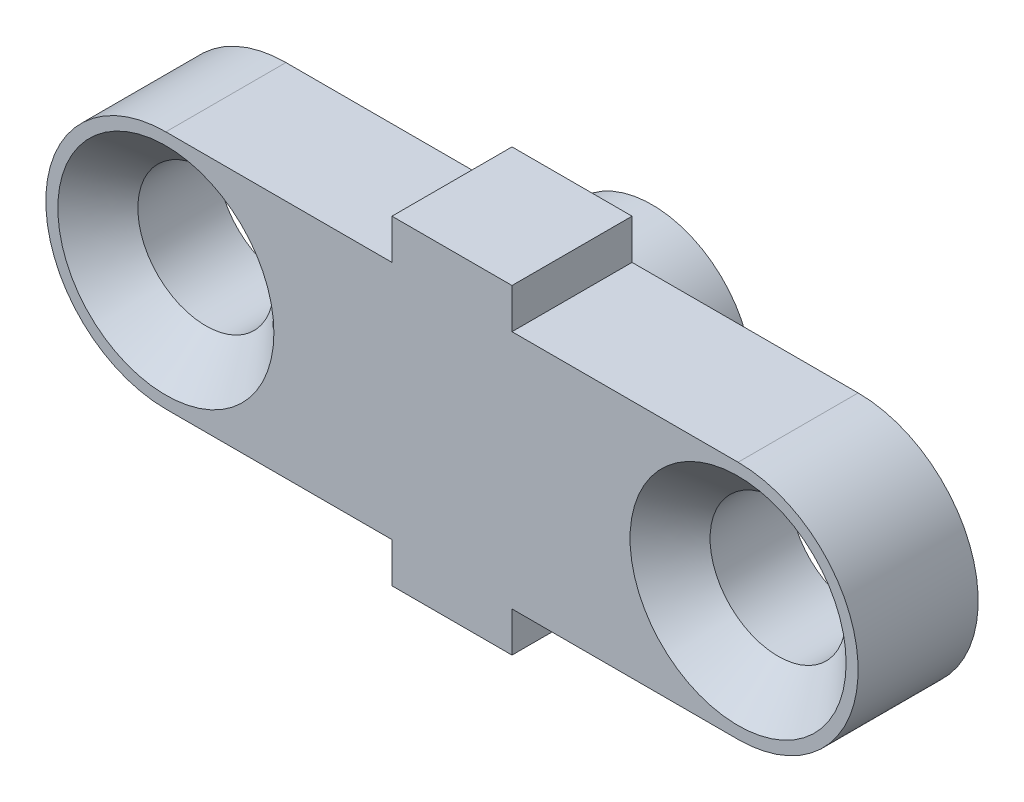
ISO-10303-21;
HEADER;
FILE_DESCRIPTION(('STEP AP214'),'2;1');
FILE_NAME('part.step','',(''),(''),'','','');
FILE_SCHEMA(('AUTOMOTIVE_DESIGN { 1 0 10303 214 1 1 1 1 }'));
ENDSEC;
DATA;
#1=APPLICATION_CONTEXT('core data for automotive mechanical design processes');
#2=APPLICATION_PROTOCOL_DEFINITION('international standard','automotive_design',2000,#1);
#3=PRODUCT_CONTEXT('',#1,'mechanical');
#4=PRODUCT('Part','Part','',(#3));
#5=PRODUCT_RELATED_PRODUCT_CATEGORY('part','',(#4));
#6=PRODUCT_DEFINITION_FORMATION('','',#4);
#7=PRODUCT_DEFINITION_CONTEXT('part definition',#1,'design');
#8=PRODUCT_DEFINITION('design','',#6,#7);
#9=PRODUCT_DEFINITION_SHAPE('','',#8);
#10=(LENGTH_UNIT() NAMED_UNIT(*) SI_UNIT(.MILLI.,.METRE.));
#11=(NAMED_UNIT(*) PLANE_ANGLE_UNIT() SI_UNIT($,.RADIAN.));
#12=(NAMED_UNIT(*) SI_UNIT($,.STERADIAN.) SOLID_ANGLE_UNIT());
#13=UNCERTAINTY_MEASURE_WITH_UNIT(LENGTH_MEASURE(1.E-05),#10,'distance_accuracy_value','');
#14=(GEOMETRIC_REPRESENTATION_CONTEXT(3) GLOBAL_UNCERTAINTY_ASSIGNED_CONTEXT((#13)) GLOBAL_UNIT_ASSIGNED_CONTEXT((#10,
#11,#12)) REPRESENTATION_CONTEXT('',''));
#15=CARTESIAN_POINT('',(0.,0.,0.));
#16=DIRECTION('',(0.,0.,1.));
#17=DIRECTION('',(1.,0.,0.));
#18=AXIS2_PLACEMENT_3D('',#15,#16,#17);
#19=CARTESIAN_POINT('',(-7.15,0.,3.));
#20=DIRECTION('',(0.,0.,1.));
#21=DIRECTION('',(1.,0.,0.));
#22=AXIS2_PLACEMENT_3D('',#19,#20,#21);
#23=PLANE('',#22);
#24=CARTESIAN_POINT('',(7.15,0.,3.));
#25=DIRECTION('',(0.,0.,1.));
#26=DIRECTION('',(1.,0.,0.));
#27=AXIS2_PLACEMENT_3D('',#24,#25,#26);
#28=CIRCLE('',#27,2.70000000000001);
#29=CARTESIAN_POINT('',(9.85000000000001,0.,3.));
#30=VERTEX_POINT('',#29);
#31=EDGE_CURVE('E213',#30,#30,#28,.F.);
#32=ORIENTED_EDGE('',*,*,#31,.T.);
#33=EDGE_LOOP('',(#32));
#34=FACE_BOUND('',#33,.T.);
#35=CARTESIAN_POINT('',(-7.15,0.,3.));
#36=DIRECTION('',(0.,0.,1.));
#37=DIRECTION('',(1.,0.,0.));
#38=AXIS2_PLACEMENT_3D('',#35,#36,#37);
#39=CIRCLE('',#38,2.7);
#40=CARTESIAN_POINT('',(-4.45,0.,3.));
#41=VERTEX_POINT('',#40);
#42=EDGE_CURVE('E210',#41,#41,#39,.F.);
#43=ORIENTED_EDGE('',*,*,#42,.T.);
#44=EDGE_LOOP('',(#43));
#45=FACE_BOUND('',#44,.T.);
#46=DIRECTION('',(0.,-1.,0.));
#47=VECTOR('',#46,1.);
#48=CARTESIAN_POINT('',(-1.5,4.,3.));
#49=LINE('',#48,#47);
#50=CARTESIAN_POINT('',(-1.5,4.,3.));
#51=VERTEX_POINT('',#50);
#52=CARTESIAN_POINT('',(-1.5,3.,3.));
#53=VERTEX_POINT('',#52);
#54=EDGE_CURVE('E180',#51,#53,#49,.T.);
#55=ORIENTED_EDGE('',*,*,#54,.T.);
#56=DIRECTION('',(-1.,0.,0.));
#57=VECTOR('',#56,1.);
#58=CARTESIAN_POINT('',(-7.15,3.,3.));
#59=LINE('',#58,#57);
#60=CARTESIAN_POINT('',(-7.15,3.,3.));
#61=VERTEX_POINT('',#60);
#62=EDGE_CURVE('E109',#53,#61,#59,.T.);
#63=ORIENTED_EDGE('',*,*,#62,.T.);
#64=CARTESIAN_POINT('',(-7.15,0.,3.));
#65=DIRECTION('',(0.,0.,1.));
#66=DIRECTION('',(1.,0.,0.));
#67=AXIS2_PLACEMENT_3D('',#64,#65,#66);
#68=CIRCLE('',#67,3.);
#69=CARTESIAN_POINT('',(-7.15,-3.,3.));
#70=VERTEX_POINT('',#69);
#71=EDGE_CURVE('E305',#61,#70,#68,.T.);
#72=ORIENTED_EDGE('',*,*,#71,.T.);
#73=DIRECTION('',(1.,0.,0.));
#74=VECTOR('',#73,1.);
#75=CARTESIAN_POINT('',(-7.15,-3.,3.));
#76=LINE('',#75,#74);
#77=CARTESIAN_POINT('',(-1.5,-3.,3.));
#78=VERTEX_POINT('',#77);
#79=EDGE_CURVE('E307',#70,#78,#76,.T.);
#80=ORIENTED_EDGE('',*,*,#79,.T.);
#81=DIRECTION('',(0.,-1.,0.));
#82=VECTOR('',#81,1.);
#83=CARTESIAN_POINT('',(-1.5,-3.,3.));
#84=LINE('',#83,#82);
#85=CARTESIAN_POINT('',(-1.5,-4.,3.));
#86=VERTEX_POINT('',#85);
#87=EDGE_CURVE('E309',#78,#86,#84,.T.);
#88=ORIENTED_EDGE('',*,*,#87,.T.);
#89=DIRECTION('',(1.,0.,0.));
#90=VECTOR('',#89,1.);
#91=CARTESIAN_POINT('',(-1.5,-4.,3.));
#92=LINE('',#91,#90);
#93=CARTESIAN_POINT('',(1.5,-4.,3.));
#94=VERTEX_POINT('',#93);
#95=EDGE_CURVE('E315',#86,#94,#92,.T.);
#96=ORIENTED_EDGE('',*,*,#95,.T.);
#97=DIRECTION('',(0.,1.,0.));
#98=VECTOR('',#97,1.);
#99=CARTESIAN_POINT('',(1.5,-3.,3.));
#100=LINE('',#99,#98);
#101=CARTESIAN_POINT('',(1.5,-3.,3.));
#102=VERTEX_POINT('',#101);
#103=EDGE_CURVE('E317',#94,#102,#100,.T.);
#104=ORIENTED_EDGE('',*,*,#103,.T.);
#105=DIRECTION('',(1.,0.,0.));
#106=VECTOR('',#105,1.);
#107=CARTESIAN_POINT('',(1.5,-3.,3.));
#108=LINE('',#107,#106);
#109=CARTESIAN_POINT('',(7.15,-3.,3.));
#110=VERTEX_POINT('',#109);
#111=EDGE_CURVE('E319',#102,#110,#108,.T.);
#112=ORIENTED_EDGE('',*,*,#111,.T.);
#113=CARTESIAN_POINT('',(7.15,0.,3.));
#114=DIRECTION('',(0.,0.,1.));
#115=DIRECTION('',(1.,0.,0.));
#116=AXIS2_PLACEMENT_3D('',#113,#114,#115);
#117=CIRCLE('',#116,3.);
#118=CARTESIAN_POINT('',(7.15,3.,3.));
#119=VERTEX_POINT('',#118);
#120=EDGE_CURVE('E139',#110,#119,#117,.T.);
#121=ORIENTED_EDGE('',*,*,#120,.T.);
#122=DIRECTION('',(-1.,0.,0.));
#123=VECTOR('',#122,1.);
#124=CARTESIAN_POINT('',(1.5,3.,3.));
#125=LINE('',#124,#123);
#126=CARTESIAN_POINT('',(1.5,3.,3.));
#127=VERTEX_POINT('',#126);
#128=EDGE_CURVE('E134',#119,#127,#125,.T.);
#129=ORIENTED_EDGE('',*,*,#128,.T.);
#130=DIRECTION('',(0.,1.,0.));
#131=VECTOR('',#130,1.);
#132=CARTESIAN_POINT('',(1.5,4.,3.));
#133=LINE('',#132,#131);
#134=CARTESIAN_POINT('',(1.5,4.,3.));
#135=VERTEX_POINT('',#134);
#136=EDGE_CURVE('E137',#127,#135,#133,.T.);
#137=ORIENTED_EDGE('',*,*,#136,.T.);
#138=DIRECTION('',(-1.,0.,0.));
#139=VECTOR('',#138,1.);
#140=CARTESIAN_POINT('',(-1.5,4.,3.));
#141=LINE('',#140,#139);
#142=EDGE_CURVE('E53',#135,#51,#141,.T.);
#143=ORIENTED_EDGE('',*,*,#142,.T.);
#144=EDGE_LOOP('',(#55,#63,#72,#80,#88,#96,#104,#112,#121,#129,#137,#143));
#145=FACE_BOUND('',#144,.T.);
#146=ADVANCED_FACE('F35',(#34,#45,#145),#23,.T.);
#147=CARTESIAN_POINT('',(-7.15,0.,0.));
#148=DIRECTION('',(0.,0.,1.));
#149=DIRECTION('',(1.,0.,0.));
#150=AXIS2_PLACEMENT_3D('',#147,#148,#149);
#151=PLANE('',#150);
#152=CARTESIAN_POINT('',(0.,0.,0.));
#153=DIRECTION('',(0.,0.,1.));
#154=DIRECTION('',(1.,0.,0.));
#155=AXIS2_PLACEMENT_3D('',#152,#153,#154);
#156=CIRCLE('',#155,2.5);
#157=CARTESIAN_POINT('',(2.5,0.,0.));
#158=VERTEX_POINT('',#157);
#159=EDGE_CURVE('E11',#158,#158,#156,.F.);
#160=ORIENTED_EDGE('',*,*,#159,.F.);
#161=EDGE_LOOP('',(#160));
#162=FACE_BOUND('',#161,.T.);
#163=DIRECTION('',(0.,-1.,0.));
#164=VECTOR('',#163,1.);
#165=CARTESIAN_POINT('',(-1.5,4.,0.));
#166=LINE('',#165,#164);
#167=CARTESIAN_POINT('',(-1.5,4.,0.));
#168=VERTEX_POINT('',#167);
#169=CARTESIAN_POINT('',(-1.5,3.,0.));
#170=VERTEX_POINT('',#169);
#171=EDGE_CURVE('E157',#168,#170,#166,.T.);
#172=ORIENTED_EDGE('',*,*,#171,.F.);
#173=DIRECTION('',(-1.,0.,0.));
#174=VECTOR('',#173,1.);
#175=CARTESIAN_POINT('',(-1.5,4.,0.));
#176=LINE('',#175,#174);
#177=CARTESIAN_POINT('',(1.5,4.,0.));
#178=VERTEX_POINT('',#177);
#179=EDGE_CURVE('E100',#178,#168,#176,.T.);
#180=ORIENTED_EDGE('',*,*,#179,.F.);
#181=DIRECTION('',(0.,1.,0.));
#182=VECTOR('',#181,1.);
#183=CARTESIAN_POINT('',(1.5,4.,0.));
#184=LINE('',#183,#182);
#185=CARTESIAN_POINT('',(1.5,3.,0.));
#186=VERTEX_POINT('',#185);
#187=EDGE_CURVE('E94',#186,#178,#184,.T.);
#188=ORIENTED_EDGE('',*,*,#187,.F.);
#189=DIRECTION('',(-1.,0.,0.));
#190=VECTOR('',#189,1.);
#191=CARTESIAN_POINT('',(1.5,3.,0.));
#192=LINE('',#191,#190);
#193=CARTESIAN_POINT('',(7.15,3.,0.));
#194=VERTEX_POINT('',#193);
#195=EDGE_CURVE('E147',#194,#186,#192,.T.);
#196=ORIENTED_EDGE('',*,*,#195,.F.);
#197=CARTESIAN_POINT('',(7.15,0.,0.));
#198=DIRECTION('',(0.,0.,1.));
#199=DIRECTION('',(1.,0.,0.));
#200=AXIS2_PLACEMENT_3D('',#197,#198,#199);
#201=CIRCLE('',#200,3.);
#202=CARTESIAN_POINT('',(7.15,-3.,0.));
#203=VERTEX_POINT('',#202);
#204=EDGE_CURVE('E175',#203,#194,#201,.T.);
#205=ORIENTED_EDGE('',*,*,#204,.F.);
#206=DIRECTION('',(1.,0.,0.));
#207=VECTOR('',#206,1.);
#208=CARTESIAN_POINT('',(1.5,-3.,0.));
#209=LINE('',#208,#207);
#210=CARTESIAN_POINT('',(1.5,-3.,0.));
#211=VERTEX_POINT('',#210);
#212=EDGE_CURVE('E173',#211,#203,#209,.T.);
#213=ORIENTED_EDGE('',*,*,#212,.F.);
#214=DIRECTION('',(0.,1.,0.));
#215=VECTOR('',#214,1.);
#216=CARTESIAN_POINT('',(1.5,-3.,0.));
#217=LINE('',#216,#215);
#218=CARTESIAN_POINT('',(1.5,-4.,0.));
#219=VERTEX_POINT('',#218);
#220=EDGE_CURVE('E171',#219,#211,#217,.T.);
#221=ORIENTED_EDGE('',*,*,#220,.F.);
#222=DIRECTION('',(1.,0.,0.));
#223=VECTOR('',#222,1.);
#224=CARTESIAN_POINT('',(-1.5,-4.,0.));
#225=LINE('',#224,#223);
#226=CARTESIAN_POINT('',(-1.5,-4.,0.));
#227=VERTEX_POINT('',#226);
#228=EDGE_CURVE('E169',#227,#219,#225,.T.);
#229=ORIENTED_EDGE('',*,*,#228,.F.);
#230=DIRECTION('',(0.,-1.,0.));
#231=VECTOR('',#230,1.);
#232=CARTESIAN_POINT('',(-1.5,-3.,0.));
#233=LINE('',#232,#231);
#234=CARTESIAN_POINT('',(-1.5,-3.,0.));
#235=VERTEX_POINT('',#234);
#236=EDGE_CURVE('E167',#235,#227,#233,.T.);
#237=ORIENTED_EDGE('',*,*,#236,.F.);
#238=DIRECTION('',(1.,0.,0.));
#239=VECTOR('',#238,1.);
#240=CARTESIAN_POINT('',(-7.15,-3.,0.));
#241=LINE('',#240,#239);
#242=CARTESIAN_POINT('',(-7.15,-3.,0.));
#243=VERTEX_POINT('',#242);
#244=EDGE_CURVE('E165',#243,#235,#241,.T.);
#245=ORIENTED_EDGE('',*,*,#244,.F.);
#246=CARTESIAN_POINT('',(-7.15,0.,0.));
#247=DIRECTION('',(0.,0.,1.));
#248=DIRECTION('',(1.,0.,0.));
#249=AXIS2_PLACEMENT_3D('',#246,#247,#248);
#250=CIRCLE('',#249,3.);
#251=CARTESIAN_POINT('',(-7.15,3.,0.));
#252=VERTEX_POINT('',#251);
#253=EDGE_CURVE('E163',#252,#243,#250,.T.);
#254=ORIENTED_EDGE('',*,*,#253,.F.);
#255=DIRECTION('',(-1.,0.,0.));
#256=VECTOR('',#255,1.);
#257=CARTESIAN_POINT('',(-7.15,3.,0.));
#258=LINE('',#257,#256);
#259=EDGE_CURVE('E160',#170,#252,#258,.T.);
#260=ORIENTED_EDGE('',*,*,#259,.F.);
#261=EDGE_LOOP('',(#172,#180,#188,#196,#205,#213,#221,#229,#237,#245,#254,#260));
#262=FACE_BOUND('',#261,.T.);
#263=CARTESIAN_POINT('',(7.15,0.,0.));
#264=DIRECTION('',(0.,0.,1.));
#265=DIRECTION('',(1.,0.,0.));
#266=AXIS2_PLACEMENT_3D('',#263,#264,#265);
#267=CIRCLE('',#266,1.7);
#268=CARTESIAN_POINT('',(8.85,0.,0.));
#269=VERTEX_POINT('',#268);
#270=EDGE_CURVE('E161',#269,#269,#267,.T.);
#271=ORIENTED_EDGE('',*,*,#270,.T.);
#272=EDGE_LOOP('',(#271));
#273=FACE_BOUND('',#272,.T.);
#274=CARTESIAN_POINT('',(-7.15,0.,0.));
#275=DIRECTION('',(0.,0.,1.));
#276=DIRECTION('',(1.,0.,0.));
#277=AXIS2_PLACEMENT_3D('',#274,#275,#276);
#278=CIRCLE('',#277,1.7);
#279=CARTESIAN_POINT('',(-5.45,0.,0.));
#280=VERTEX_POINT('',#279);
#281=EDGE_CURVE('E337',#280,#280,#278,.T.);
#282=ORIENTED_EDGE('',*,*,#281,.T.);
#283=EDGE_LOOP('',(#282));
#284=FACE_BOUND('',#283,.T.);
#285=ADVANCED_FACE('F235',(#162,#262,#273,#284),#151,.F.);
#286=CARTESIAN_POINT('',(-1.5,4.,3.));
#287=DIRECTION('',(1.,0.,0.));
#288=DIRECTION('',(0.,1.,0.));
#289=AXIS2_PLACEMENT_3D('',#286,#287,#288);
#290=PLANE('',#289);
#291=ORIENTED_EDGE('',*,*,#171,.T.);
#292=DIRECTION('',(0.,0.,-1.));
#293=VECTOR('',#292,1.);
#294=CARTESIAN_POINT('',(-1.5,3.,3.));
#295=LINE('',#294,#293);
#296=EDGE_CURVE('E205',#53,#170,#295,.T.);
#297=ORIENTED_EDGE('',*,*,#296,.F.);
#298=ORIENTED_EDGE('',*,*,#54,.F.);
#299=DIRECTION('',(0.,0.,-1.));
#300=VECTOR('',#299,1.);
#301=CARTESIAN_POINT('',(-1.5,4.,3.));
#302=LINE('',#301,#300);
#303=EDGE_CURVE('E153',#51,#168,#302,.T.);
#304=ORIENTED_EDGE('',*,*,#303,.T.);
#305=EDGE_LOOP('',(#291,#297,#298,#304));
#306=FACE_BOUND('',#305,.T.);
#307=ADVANCED_FACE('F241',(#306),#290,.F.);
#308=CARTESIAN_POINT('',(-7.15,3.,3.));
#309=DIRECTION('',(0.,-1.,0.));
#310=DIRECTION('',(0.,0.,-1.));
#311=AXIS2_PLACEMENT_3D('',#308,#309,#310);
#312=PLANE('',#311);
#313=ORIENTED_EDGE('',*,*,#259,.T.);
#314=DIRECTION('',(0.,0.,-1.));
#315=VECTOR('',#314,1.);
#316=CARTESIAN_POINT('',(-7.15,3.,3.));
#317=LINE('',#316,#315);
#318=EDGE_CURVE('E202',#61,#252,#317,.T.);
#319=ORIENTED_EDGE('',*,*,#318,.F.);
#320=ORIENTED_EDGE('',*,*,#62,.F.);
#321=ORIENTED_EDGE('',*,*,#296,.T.);
#322=EDGE_LOOP('',(#313,#319,#320,#321));
#323=FACE_BOUND('',#322,.T.);
#324=ADVANCED_FACE('F283',(#323),#312,.F.);
#325=CARTESIAN_POINT('',(-7.15,0.,3.));
#326=DIRECTION('',(0.,0.,-1.));
#327=DIRECTION('',(-1.,0.,0.));
#328=AXIS2_PLACEMENT_3D('',#325,#326,#327);
#329=CYLINDRICAL_SURFACE('',#328,3.);
#330=ORIENTED_EDGE('',*,*,#253,.T.);
#331=DIRECTION('',(0.,0.,-1.));
#332=VECTOR('',#331,1.);
#333=CARTESIAN_POINT('',(-7.15,-3.,3.));
#334=LINE('',#333,#332);
#335=EDGE_CURVE('E199',#70,#243,#334,.T.);
#336=ORIENTED_EDGE('',*,*,#335,.F.);
#337=ORIENTED_EDGE('',*,*,#71,.F.);
#338=ORIENTED_EDGE('',*,*,#318,.T.);
#339=EDGE_LOOP('',(#330,#336,#337,#338));
#340=FACE_BOUND('',#339,.T.);
#341=ADVANCED_FACE('F279',(#340),#329,.T.);
#342=CARTESIAN_POINT('',(-7.15,-3.,3.));
#343=DIRECTION('',(0.,1.,0.));
#344=DIRECTION('',(0.,0.,1.));
#345=AXIS2_PLACEMENT_3D('',#342,#343,#344);
#346=PLANE('',#345);
#347=ORIENTED_EDGE('',*,*,#244,.T.);
#348=DIRECTION('',(0.,0.,-1.));
#349=VECTOR('',#348,1.);
#350=CARTESIAN_POINT('',(-1.5,-3.,3.));
#351=LINE('',#350,#349);
#352=EDGE_CURVE('E196',#78,#235,#351,.T.);
#353=ORIENTED_EDGE('',*,*,#352,.F.);
#354=ORIENTED_EDGE('',*,*,#79,.F.);
#355=ORIENTED_EDGE('',*,*,#335,.T.);
#356=EDGE_LOOP('',(#347,#353,#354,#355));
#357=FACE_BOUND('',#356,.T.);
#358=ADVANCED_FACE('F275',(#357),#346,.F.);
#359=CARTESIAN_POINT('',(-1.5,-3.,3.));
#360=DIRECTION('',(1.,0.,0.));
#361=DIRECTION('',(0.,0.,-1.));
#362=AXIS2_PLACEMENT_3D('',#359,#360,#361);
#363=PLANE('',#362);
#364=ORIENTED_EDGE('',*,*,#236,.T.);
#365=DIRECTION('',(0.,0.,-1.));
#366=VECTOR('',#365,1.);
#367=CARTESIAN_POINT('',(-1.5,-4.,3.));
#368=LINE('',#367,#366);
#369=EDGE_CURVE('E193',#86,#227,#368,.T.);
#370=ORIENTED_EDGE('',*,*,#369,.F.);
#371=ORIENTED_EDGE('',*,*,#87,.F.);
#372=ORIENTED_EDGE('',*,*,#352,.T.);
#373=EDGE_LOOP('',(#364,#370,#371,#372));
#374=FACE_BOUND('',#373,.T.);
#375=ADVANCED_FACE('F271',(#374),#363,.F.);
#376=CARTESIAN_POINT('',(-1.5,-4.,3.));
#377=DIRECTION('',(0.,1.,0.));
#378=DIRECTION('',(0.,0.,1.));
#379=AXIS2_PLACEMENT_3D('',#376,#377,#378);
#380=PLANE('',#379);
#381=ORIENTED_EDGE('',*,*,#228,.T.);
#382=DIRECTION('',(0.,0.,-1.));
#383=VECTOR('',#382,1.);
#384=CARTESIAN_POINT('',(1.5,-4.,3.));
#385=LINE('',#384,#383);
#386=EDGE_CURVE('E190',#94,#219,#385,.T.);
#387=ORIENTED_EDGE('',*,*,#386,.F.);
#388=ORIENTED_EDGE('',*,*,#95,.F.);
#389=ORIENTED_EDGE('',*,*,#369,.T.);
#390=EDGE_LOOP('',(#381,#387,#388,#389));
#391=FACE_BOUND('',#390,.T.);
#392=ADVANCED_FACE('F267',(#391),#380,.F.);
#393=CARTESIAN_POINT('',(1.5,-3.,3.));
#394=DIRECTION('',(-1.,0.,0.));
#395=DIRECTION('',(0.,-1.,0.));
#396=AXIS2_PLACEMENT_3D('',#393,#394,#395);
#397=PLANE('',#396);
#398=ORIENTED_EDGE('',*,*,#220,.T.);
#399=DIRECTION('',(0.,0.,-1.));
#400=VECTOR('',#399,1.);
#401=CARTESIAN_POINT('',(1.5,-3.,3.));
#402=LINE('',#401,#400);
#403=EDGE_CURVE('E187',#102,#211,#402,.T.);
#404=ORIENTED_EDGE('',*,*,#403,.F.);
#405=ORIENTED_EDGE('',*,*,#103,.F.);
#406=ORIENTED_EDGE('',*,*,#386,.T.);
#407=EDGE_LOOP('',(#398,#404,#405,#406));
#408=FACE_BOUND('',#407,.T.);
#409=ADVANCED_FACE('F263',(#408),#397,.F.);
#410=CARTESIAN_POINT('',(1.5,-3.,3.));
#411=DIRECTION('',(0.,1.,0.));
#412=DIRECTION('',(-1.,0.,0.));
#413=AXIS2_PLACEMENT_3D('',#410,#411,#412);
#414=PLANE('',#413);
#415=ORIENTED_EDGE('',*,*,#212,.T.);
#416=DIRECTION('',(0.,0.,-1.));
#417=VECTOR('',#416,1.);
#418=CARTESIAN_POINT('',(7.15,-3.,3.));
#419=LINE('',#418,#417);
#420=EDGE_CURVE('E184',#110,#203,#419,.T.);
#421=ORIENTED_EDGE('',*,*,#420,.F.);
#422=ORIENTED_EDGE('',*,*,#111,.F.);
#423=ORIENTED_EDGE('',*,*,#403,.T.);
#424=EDGE_LOOP('',(#415,#421,#422,#423));
#425=FACE_BOUND('',#424,.T.);
#426=ADVANCED_FACE('F259',(#425),#414,.F.);
#427=CARTESIAN_POINT('',(7.15,0.,3.));
#428=DIRECTION('',(0.,0.,-1.));
#429=DIRECTION('',(-1.,0.,0.));
#430=AXIS2_PLACEMENT_3D('',#427,#428,#429);
#431=CYLINDRICAL_SURFACE('',#430,3.);
#432=ORIENTED_EDGE('',*,*,#204,.T.);
#433=DIRECTION('',(0.,0.,-1.));
#434=VECTOR('',#433,1.);
#435=CARTESIAN_POINT('',(7.15,3.,3.));
#436=LINE('',#435,#434);
#437=EDGE_CURVE('E148',#119,#194,#436,.T.);
#438=ORIENTED_EDGE('',*,*,#437,.F.);
#439=ORIENTED_EDGE('',*,*,#120,.F.);
#440=ORIENTED_EDGE('',*,*,#420,.T.);
#441=EDGE_LOOP('',(#432,#438,#439,#440));
#442=FACE_BOUND('',#441,.T.);
#443=ADVANCED_FACE('F256',(#442),#431,.T.);
#444=CARTESIAN_POINT('',(1.5,3.,3.));
#445=DIRECTION('',(0.,-1.,0.));
#446=DIRECTION('',(1.,0.,0.));
#447=AXIS2_PLACEMENT_3D('',#444,#445,#446);
#448=PLANE('',#447);
#449=ORIENTED_EDGE('',*,*,#195,.T.);
#450=DIRECTION('',(0.,0.,-1.));
#451=VECTOR('',#450,1.);
#452=CARTESIAN_POINT('',(1.5,3.,3.));
#453=LINE('',#452,#451);
#454=EDGE_CURVE('E144',#127,#186,#453,.T.);
#455=ORIENTED_EDGE('',*,*,#454,.F.);
#456=ORIENTED_EDGE('',*,*,#128,.F.);
#457=ORIENTED_EDGE('',*,*,#437,.T.);
#458=EDGE_LOOP('',(#449,#455,#456,#457));
#459=FACE_BOUND('',#458,.T.);
#460=ADVANCED_FACE('F145',(#459),#448,.F.);
#461=CARTESIAN_POINT('',(1.5,4.,3.));
#462=DIRECTION('',(-1.,0.,0.));
#463=DIRECTION('',(0.,-1.,0.));
#464=AXIS2_PLACEMENT_3D('',#461,#462,#463);
#465=PLANE('',#464);
#466=ORIENTED_EDGE('',*,*,#187,.T.);
#467=DIRECTION('',(0.,0.,-1.));
#468=VECTOR('',#467,1.);
#469=CARTESIAN_POINT('',(1.5,4.,3.));
#470=LINE('',#469,#468);
#471=EDGE_CURVE('E149',#135,#178,#470,.T.);
#472=ORIENTED_EDGE('',*,*,#471,.F.);
#473=ORIENTED_EDGE('',*,*,#136,.F.);
#474=ORIENTED_EDGE('',*,*,#454,.T.);
#475=EDGE_LOOP('',(#466,#472,#473,#474));
#476=FACE_BOUND('',#475,.T.);
#477=ADVANCED_FACE('F151',(#476),#465,.F.);
#478=CARTESIAN_POINT('',(-1.5,4.,3.));
#479=DIRECTION('',(0.,-1.,0.));
#480=DIRECTION('',(0.,0.,-1.));
#481=AXIS2_PLACEMENT_3D('',#478,#479,#480);
#482=PLANE('',#481);
#483=ORIENTED_EDGE('',*,*,#179,.T.);
#484=ORIENTED_EDGE('',*,*,#303,.F.);
#485=ORIENTED_EDGE('',*,*,#142,.F.);
#486=ORIENTED_EDGE('',*,*,#471,.T.);
#487=EDGE_LOOP('',(#483,#484,#485,#486));
#488=FACE_BOUND('',#487,.T.);
#489=ADVANCED_FACE('F249',(#488),#482,.F.);
#490=CARTESIAN_POINT('',(7.15,0.,3.));
#491=DIRECTION('',(0.,0.,-1.));
#492=DIRECTION('',(-1.,0.,0.));
#493=AXIS2_PLACEMENT_3D('',#490,#491,#492);
#494=CYLINDRICAL_SURFACE('',#493,1.7);
#495=CARTESIAN_POINT('',(7.15,0.,2.));
#496=DIRECTION('',(0.,0.,1.));
#497=DIRECTION('',(1.,0.,0.));
#498=AXIS2_PLACEMENT_3D('',#495,#496,#497);
#499=CIRCLE('',#498,1.7);
#500=CARTESIAN_POINT('',(8.85,0.,2.));
#501=VERTEX_POINT('',#500);
#502=EDGE_CURVE('E207',#501,#501,#499,.T.);
#503=ORIENTED_EDGE('',*,*,#502,.T.);
#504=EDGE_LOOP('',(#503));
#505=FACE_BOUND('',#504,.T.);
#506=ORIENTED_EDGE('',*,*,#270,.F.);
#507=EDGE_LOOP('',(#506));
#508=FACE_BOUND('',#507,.T.);
#509=ADVANCED_FACE('F246',(#505,#508),#494,.F.);
#510=CARTESIAN_POINT('',(-7.15,0.,3.));
#511=DIRECTION('',(0.,0.,-1.));
#512=DIRECTION('',(-1.,0.,0.));
#513=AXIS2_PLACEMENT_3D('',#510,#511,#512);
#514=CYLINDRICAL_SURFACE('',#513,1.7);
#515=CARTESIAN_POINT('',(-7.15,0.,2.));
#516=DIRECTION('',(0.,0.,1.));
#517=DIRECTION('',(1.,0.,0.));
#518=AXIS2_PLACEMENT_3D('',#515,#516,#517);
#519=CIRCLE('',#518,1.7);
#520=CARTESIAN_POINT('',(-5.45,0.,2.));
#521=VERTEX_POINT('',#520);
#522=EDGE_CURVE('E45',#521,#521,#519,.T.);
#523=ORIENTED_EDGE('',*,*,#522,.T.);
#524=EDGE_LOOP('',(#523));
#525=FACE_BOUND('',#524,.T.);
#526=ORIENTED_EDGE('',*,*,#281,.F.);
#527=EDGE_LOOP('',(#526));
#528=FACE_BOUND('',#527,.T.);
#529=ADVANCED_FACE('F218',(#525,#528),#514,.F.);
#530=CARTESIAN_POINT('',(7.15,0.,2.));
#531=DIRECTION('',(0.,0.,1.));
#532=DIRECTION('',(1.,0.,0.));
#533=AXIS2_PLACEMENT_3D('',#530,#531,#532);
#534=CONICAL_SURFACE('',#533,1.7,0.78539816339745);
#535=ORIENTED_EDGE('',*,*,#31,.F.);
#536=EDGE_LOOP('',(#535));
#537=FACE_BOUND('',#536,.T.);
#538=ORIENTED_EDGE('',*,*,#502,.F.);
#539=EDGE_LOOP('',(#538));
#540=FACE_BOUND('',#539,.T.);
#541=ADVANCED_FACE('F223',(#537,#540),#534,.F.);
#542=CARTESIAN_POINT('',(-7.15,0.,2.));
#543=DIRECTION('',(0.,0.,1.));
#544=DIRECTION('',(1.,0.,0.));
#545=AXIS2_PLACEMENT_3D('',#542,#543,#544);
#546=CONICAL_SURFACE('',#545,1.7,0.78539816339745);
#547=ORIENTED_EDGE('',*,*,#42,.F.);
#548=EDGE_LOOP('',(#547));
#549=FACE_BOUND('',#548,.T.);
#550=ORIENTED_EDGE('',*,*,#522,.F.);
#551=EDGE_LOOP('',(#550));
#552=FACE_BOUND('',#551,.T.);
#553=ADVANCED_FACE('F38',(#549,#552),#546,.F.);
#554=CARTESIAN_POINT('',(0.,0.,-2.));
#555=DIRECTION('',(0.,0.,1.));
#556=DIRECTION('',(1.,0.,0.));
#557=AXIS2_PLACEMENT_3D('',#554,#555,#556);
#558=CYLINDRICAL_SURFACE('',#557,2.5);
#559=CARTESIAN_POINT('',(0.,0.,-2.));
#560=DIRECTION('',(0.,0.,-1.));
#561=DIRECTION('',(-1.,0.,0.));
#562=AXIS2_PLACEMENT_3D('',#559,#560,#561);
#563=CIRCLE('',#562,2.5);
#564=CARTESIAN_POINT('',(-2.5,0.,-2.));
#565=VERTEX_POINT('',#564);
#566=EDGE_CURVE('E340',#565,#565,#563,.T.);
#567=ORIENTED_EDGE('',*,*,#566,.F.);
#568=EDGE_LOOP('',(#567));
#569=FACE_BOUND('',#568,.T.);
#570=ORIENTED_EDGE('',*,*,#159,.T.);
#571=EDGE_LOOP('',(#570));
#572=FACE_BOUND('',#571,.T.);
#573=ADVANCED_FACE('F222',(#569,#572),#558,.T.);
#574=CARTESIAN_POINT('',(0.,0.,-2.));
#575=DIRECTION('',(0.,0.,-1.));
#576=DIRECTION('',(-1.,0.,0.));
#577=AXIS2_PLACEMENT_3D('',#574,#575,#576);
#578=PLANE('',#577);
#579=ORIENTED_EDGE('',*,*,#566,.T.);
#580=EDGE_LOOP('',(#579));
#581=FACE_BOUND('',#580,.T.);
#582=ADVANCED_FACE('F229',(#581),#578,.T.);
#583=CLOSED_SHELL('',(#146,#285,#307,#324,#341,#358,#375,#392,#409,#426,#443,#460,#477,#489,
#509,#529,#541,#553,#573,#582));
#584=MANIFOLD_SOLID_BREP('B2',#583);
#585=ADVANCED_BREP_SHAPE_REPRESENTATION('',(#18,#584),#14);
#586=SHAPE_DEFINITION_REPRESENTATION(#9,#585);
ENDSEC;
END-ISO-10303-21;
